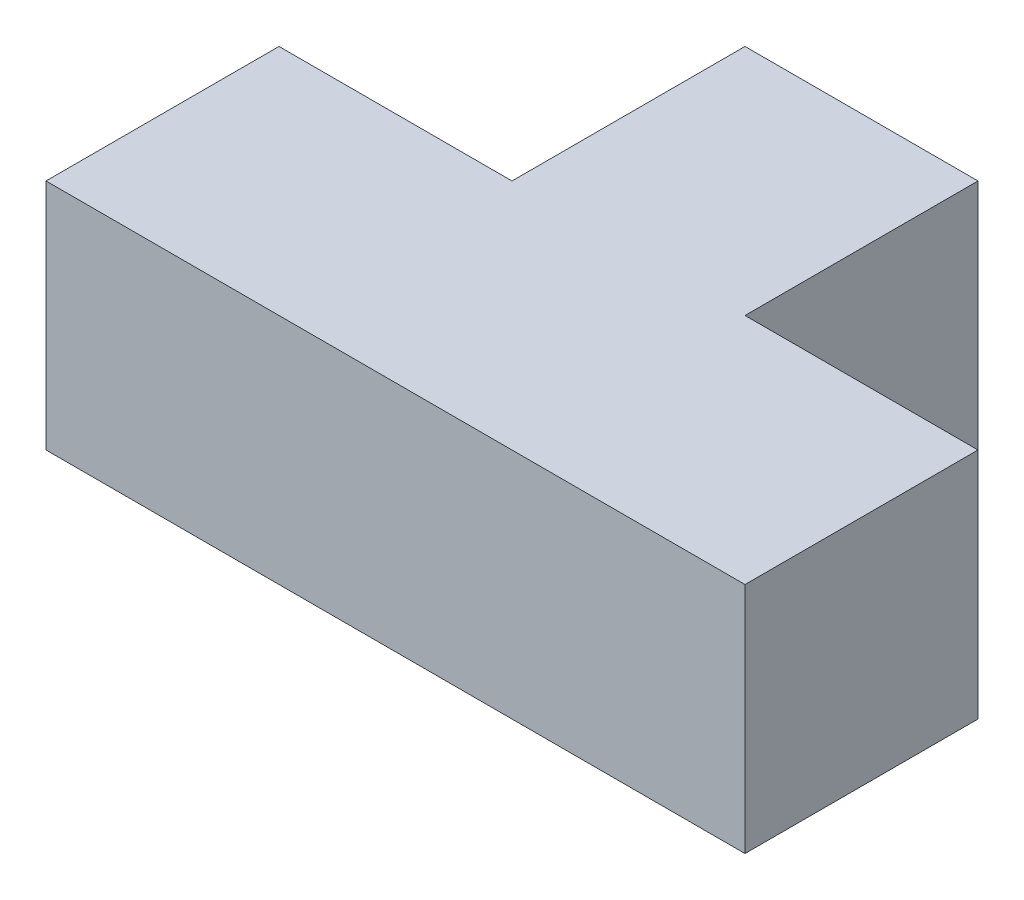
ISO-10303-21;
HEADER;
FILE_DESCRIPTION(('STEP AP214'),'2;1');
FILE_NAME('part.step','',(''),(''),'','','');
FILE_SCHEMA(('AUTOMOTIVE_DESIGN { 1 0 10303 214 1 1 1 1 }'));
ENDSEC;
DATA;
#1=APPLICATION_CONTEXT('core data for automotive mechanical design processes');
#2=APPLICATION_PROTOCOL_DEFINITION('international standard','automotive_design',2000,#1);
#3=PRODUCT_CONTEXT('',#1,'mechanical');
#4=PRODUCT('Part','Part','',(#3));
#5=PRODUCT_RELATED_PRODUCT_CATEGORY('part','',(#4));
#6=PRODUCT_DEFINITION_FORMATION('','',#4);
#7=PRODUCT_DEFINITION_CONTEXT('part definition',#1,'design');
#8=PRODUCT_DEFINITION('design','',#6,#7);
#9=PRODUCT_DEFINITION_SHAPE('','',#8);
#10=(LENGTH_UNIT() NAMED_UNIT(*) SI_UNIT(.MILLI.,.METRE.));
#11=(NAMED_UNIT(*) PLANE_ANGLE_UNIT() SI_UNIT($,.RADIAN.));
#12=(NAMED_UNIT(*) SI_UNIT($,.STERADIAN.) SOLID_ANGLE_UNIT());
#13=UNCERTAINTY_MEASURE_WITH_UNIT(LENGTH_MEASURE(1.E-05),#10,'distance_accuracy_value','');
#14=(GEOMETRIC_REPRESENTATION_CONTEXT(3) GLOBAL_UNCERTAINTY_ASSIGNED_CONTEXT((#13)) GLOBAL_UNIT_ASSIGNED_CONTEXT((#10,
#11,#12)) REPRESENTATION_CONTEXT('',''));
#15=CARTESIAN_POINT('',(0.,0.,0.));
#16=DIRECTION('',(0.,0.,1.));
#17=DIRECTION('',(1.,0.,0.));
#18=AXIS2_PLACEMENT_3D('',#15,#16,#17);
#19=CARTESIAN_POINT('',(-30.,30.,-30.));
#20=DIRECTION('',(1.,0.,0.));
#21=DIRECTION('',(0.,0.,-1.));
#22=AXIS2_PLACEMENT_3D('',#19,#20,#21);
#23=PLANE('',#22);
#24=DIRECTION('',(0.,0.,1.));
#25=VECTOR('',#24,1.);
#26=CARTESIAN_POINT('',(-30.,0.,-30.));
#27=LINE('',#26,#25);
#28=CARTESIAN_POINT('',(-30.,0.,-30.));
#29=VERTEX_POINT('',#28);
#30=CARTESIAN_POINT('',(-30.,0.,0.));
#31=VERTEX_POINT('',#30);
#32=EDGE_CURVE('E139',#29,#31,#27,.T.);
#33=ORIENTED_EDGE('',*,*,#32,.T.);
#34=DIRECTION('',(0.,-1.,0.));
#35=VECTOR('',#34,1.);
#36=CARTESIAN_POINT('',(-30.,30.,0.));
#37=LINE('',#36,#35);
#38=CARTESIAN_POINT('',(-30.,30.,0.));
#39=VERTEX_POINT('',#38);
#40=EDGE_CURVE('E11',#39,#31,#37,.T.);
#41=ORIENTED_EDGE('',*,*,#40,.F.);
#42=DIRECTION('',(0.,0.,1.));
#43=VECTOR('',#42,1.);
#44=CARTESIAN_POINT('',(-30.,30.,-30.));
#45=LINE('',#44,#43);
#46=CARTESIAN_POINT('',(-30.,30.,-30.));
#47=VERTEX_POINT('',#46);
#48=EDGE_CURVE('E153',#47,#39,#45,.T.);
#49=ORIENTED_EDGE('',*,*,#48,.F.);
#50=DIRECTION('',(0.,-1.,0.));
#51=VECTOR('',#50,1.);
#52=CARTESIAN_POINT('',(-30.,30.,-30.));
#53=LINE('',#52,#51);
#54=EDGE_CURVE('E135',#47,#29,#53,.T.);
#55=ORIENTED_EDGE('',*,*,#54,.T.);
#56=EDGE_LOOP('',(#33,#41,#49,#55));
#57=FACE_BOUND('',#56,.T.);
#58=ADVANCED_FACE('F43',(#57),#23,.F.);
#59=CARTESIAN_POINT('',(-30.,30.,0.));
#60=DIRECTION('',(0.,0.,-1.));
#61=DIRECTION('',(-1.,0.,0.));
#62=AXIS2_PLACEMENT_3D('',#59,#60,#61);
#63=PLANE('',#62);
#64=DIRECTION('',(1.,0.,0.));
#65=VECTOR('',#64,1.);
#66=CARTESIAN_POINT('',(-30.,0.,0.));
#67=LINE('',#66,#65);
#68=CARTESIAN_POINT('',(60.,0.,0.));
#69=VERTEX_POINT('',#68);
#70=EDGE_CURVE('E142',#31,#69,#67,.T.);
#71=ORIENTED_EDGE('',*,*,#70,.T.);
#72=DIRECTION('',(0.,-1.,0.));
#73=VECTOR('',#72,1.);
#74=CARTESIAN_POINT('',(60.,30.,0.));
#75=LINE('',#74,#73);
#76=CARTESIAN_POINT('',(60.,30.,0.));
#77=VERTEX_POINT('',#76);
#78=EDGE_CURVE('E51',#77,#69,#75,.T.);
#79=ORIENTED_EDGE('',*,*,#78,.F.);
#80=DIRECTION('',(1.,0.,0.));
#81=VECTOR('',#80,1.);
#82=CARTESIAN_POINT('',(-30.,30.,0.));
#83=LINE('',#82,#81);
#84=EDGE_CURVE('E102',#39,#77,#83,.T.);
#85=ORIENTED_EDGE('',*,*,#84,.F.);
#86=ORIENTED_EDGE('',*,*,#40,.T.);
#87=EDGE_LOOP('',(#71,#79,#85,#86));
#88=FACE_BOUND('',#87,.T.);
#89=ADVANCED_FACE('F188',(#88),#63,.F.);
#90=CARTESIAN_POINT('',(60.,30.,-30.));
#91=DIRECTION('',(-1.,0.,0.));
#92=DIRECTION('',(0.,0.,1.));
#93=AXIS2_PLACEMENT_3D('',#90,#91,#92);
#94=PLANE('',#93);
#95=DIRECTION('',(0.,0.,-1.));
#96=VECTOR('',#95,1.);
#97=CARTESIAN_POINT('',(60.,0.,-30.));
#98=LINE('',#97,#96);
#99=CARTESIAN_POINT('',(60.,0.,-30.));
#100=VERTEX_POINT('',#99);
#101=EDGE_CURVE('E144',#69,#100,#98,.T.);
#102=ORIENTED_EDGE('',*,*,#101,.T.);
#103=DIRECTION('',(0.,-1.,0.));
#104=VECTOR('',#103,1.);
#105=CARTESIAN_POINT('',(60.,30.,-30.));
#106=LINE('',#105,#104);
#107=CARTESIAN_POINT('',(60.,30.,-30.));
#108=VERTEX_POINT('',#107);
#109=EDGE_CURVE('E160',#108,#100,#106,.T.);
#110=ORIENTED_EDGE('',*,*,#109,.F.);
#111=DIRECTION('',(0.,0.,-1.));
#112=VECTOR('',#111,1.);
#113=CARTESIAN_POINT('',(60.,30.,-30.));
#114=LINE('',#113,#112);
#115=EDGE_CURVE('E168',#77,#108,#114,.T.);
#116=ORIENTED_EDGE('',*,*,#115,.F.);
#117=ORIENTED_EDGE('',*,*,#78,.T.);
#118=EDGE_LOOP('',(#102,#110,#116,#117));
#119=FACE_BOUND('',#118,.T.);
#120=ADVANCED_FACE('F166',(#119),#94,.F.);
#121=CARTESIAN_POINT('',(30.,30.,-30.));
#122=DIRECTION('',(0.,0.,1.));
#123=DIRECTION('',(1.,0.,0.));
#124=AXIS2_PLACEMENT_3D('',#121,#122,#123);
#125=PLANE('',#124);
#126=DIRECTION('',(-1.,0.,0.));
#127=VECTOR('',#126,1.);
#128=CARTESIAN_POINT('',(30.,0.,-30.));
#129=LINE('',#128,#127);
#130=CARTESIAN_POINT('',(30.,0.,-30.));
#131=VERTEX_POINT('',#130);
#132=EDGE_CURVE('E146',#100,#131,#129,.T.);
#133=ORIENTED_EDGE('',*,*,#132,.T.);
#134=DIRECTION('',(0.,-1.,0.));
#135=VECTOR('',#134,1.);
#136=CARTESIAN_POINT('',(30.,30.,-30.));
#137=LINE('',#136,#135);
#138=CARTESIAN_POINT('',(30.,30.,-30.));
#139=VERTEX_POINT('',#138);
#140=EDGE_CURVE('E157',#139,#131,#137,.T.);
#141=ORIENTED_EDGE('',*,*,#140,.F.);
#142=DIRECTION('',(-1.,0.,0.));
#143=VECTOR('',#142,1.);
#144=CARTESIAN_POINT('',(30.,30.,-30.));
#145=LINE('',#144,#143);
#146=EDGE_CURVE('E180',#108,#139,#145,.T.);
#147=ORIENTED_EDGE('',*,*,#146,.F.);
#148=ORIENTED_EDGE('',*,*,#109,.T.);
#149=EDGE_LOOP('',(#133,#141,#147,#148));
#150=FACE_BOUND('',#149,.T.);
#151=ADVANCED_FACE('F176',(#150),#125,.F.);
#152=CARTESIAN_POINT('',(30.,30.,-60.));
#153=DIRECTION('',(-1.,0.,0.));
#154=DIRECTION('',(0.,0.,1.));
#155=AXIS2_PLACEMENT_3D('',#152,#153,#154);
#156=PLANE('',#155);
#157=DIRECTION('',(0.,0.,-1.));
#158=VECTOR('',#157,1.);
#159=CARTESIAN_POINT('',(30.,0.,-60.));
#160=LINE('',#159,#158);
#161=CARTESIAN_POINT('',(30.,0.,-60.));
#162=VERTEX_POINT('',#161);
#163=EDGE_CURVE('E148',#131,#162,#160,.T.);
#164=ORIENTED_EDGE('',*,*,#163,.T.);
#165=DIRECTION('',(0.,-1.,0.));
#166=VECTOR('',#165,1.);
#167=CARTESIAN_POINT('',(30.,30.,-60.));
#168=LINE('',#167,#166);
#169=CARTESIAN_POINT('',(30.,30.,-60.));
#170=VERTEX_POINT('',#169);
#171=EDGE_CURVE('E130',#170,#162,#168,.T.);
#172=ORIENTED_EDGE('',*,*,#171,.F.);
#173=DIRECTION('',(0.,0.,-1.));
#174=VECTOR('',#173,1.);
#175=CARTESIAN_POINT('',(30.,30.,-60.));
#176=LINE('',#175,#174);
#177=EDGE_CURVE('E121',#139,#170,#176,.T.);
#178=ORIENTED_EDGE('',*,*,#177,.F.);
#179=ORIENTED_EDGE('',*,*,#140,.T.);
#180=EDGE_LOOP('',(#164,#172,#178,#179));
#181=FACE_BOUND('',#180,.T.);
#182=ADVANCED_FACE('F179',(#181),#156,.F.);
#183=CARTESIAN_POINT('',(0.,30.,-60.));
#184=DIRECTION('',(0.,0.,1.));
#185=DIRECTION('',(1.,0.,0.));
#186=AXIS2_PLACEMENT_3D('',#183,#184,#185);
#187=PLANE('',#186);
#188=DIRECTION('',(-1.,0.,0.));
#189=VECTOR('',#188,1.);
#190=CARTESIAN_POINT('',(0.,0.,-60.));
#191=LINE('',#190,#189);
#192=CARTESIAN_POINT('',(0.,0.,-60.));
#193=VERTEX_POINT('',#192);
#194=EDGE_CURVE('E129',#162,#193,#191,.T.);
#195=ORIENTED_EDGE('',*,*,#194,.T.);
#196=DIRECTION('',(0.,-1.,0.));
#197=VECTOR('',#196,1.);
#198=CARTESIAN_POINT('',(0.,30.,-60.));
#199=LINE('',#198,#197);
#200=CARTESIAN_POINT('',(0.,30.,-60.));
#201=VERTEX_POINT('',#200);
#202=EDGE_CURVE('E126',#201,#193,#199,.T.);
#203=ORIENTED_EDGE('',*,*,#202,.F.);
#204=DIRECTION('',(-1.,0.,0.));
#205=VECTOR('',#204,1.);
#206=CARTESIAN_POINT('',(0.,30.,-60.));
#207=LINE('',#206,#205);
#208=EDGE_CURVE('E115',#170,#201,#207,.T.);
#209=ORIENTED_EDGE('',*,*,#208,.F.);
#210=ORIENTED_EDGE('',*,*,#171,.T.);
#211=EDGE_LOOP('',(#195,#203,#209,#210));
#212=FACE_BOUND('',#211,.T.);
#213=ADVANCED_FACE('F127',(#212),#187,.F.);
#214=CARTESIAN_POINT('',(0.,30.,-30.));
#215=DIRECTION('',(1.,0.,0.));
#216=DIRECTION('',(0.,0.,-1.));
#217=AXIS2_PLACEMENT_3D('',#214,#215,#216);
#218=PLANE('',#217);
#219=DIRECTION('',(0.,0.,1.));
#220=VECTOR('',#219,1.);
#221=CARTESIAN_POINT('',(0.,0.,-30.));
#222=LINE('',#221,#220);
#223=CARTESIAN_POINT('',(0.,0.,-30.));
#224=VERTEX_POINT('',#223);
#225=EDGE_CURVE('E88',#193,#224,#222,.T.);
#226=ORIENTED_EDGE('',*,*,#225,.T.);
#227=DIRECTION('',(0.,-1.,0.));
#228=VECTOR('',#227,1.);
#229=CARTESIAN_POINT('',(0.,30.,-30.));
#230=LINE('',#229,#228);
#231=CARTESIAN_POINT('',(0.,30.,-30.));
#232=VERTEX_POINT('',#231);
#233=EDGE_CURVE('E131',#232,#224,#230,.T.);
#234=ORIENTED_EDGE('',*,*,#233,.F.);
#235=DIRECTION('',(0.,0.,1.));
#236=VECTOR('',#235,1.);
#237=CARTESIAN_POINT('',(0.,30.,-30.));
#238=LINE('',#237,#236);
#239=EDGE_CURVE('E119',#201,#232,#238,.T.);
#240=ORIENTED_EDGE('',*,*,#239,.F.);
#241=ORIENTED_EDGE('',*,*,#202,.T.);
#242=EDGE_LOOP('',(#226,#234,#240,#241));
#243=FACE_BOUND('',#242,.T.);
#244=ADVANCED_FACE('F133',(#243),#218,.F.);
#245=CARTESIAN_POINT('',(-30.,30.,-30.));
#246=DIRECTION('',(0.,0.,1.));
#247=DIRECTION('',(1.,0.,0.));
#248=AXIS2_PLACEMENT_3D('',#245,#246,#247);
#249=PLANE('',#248);
#250=DIRECTION('',(-1.,0.,0.));
#251=VECTOR('',#250,1.);
#252=CARTESIAN_POINT('',(-30.,0.,-30.));
#253=LINE('',#252,#251);
#254=EDGE_CURVE('E94',#224,#29,#253,.T.);
#255=ORIENTED_EDGE('',*,*,#254,.T.);
#256=ORIENTED_EDGE('',*,*,#54,.F.);
#257=DIRECTION('',(-1.,0.,0.));
#258=VECTOR('',#257,1.);
#259=CARTESIAN_POINT('',(-30.,30.,-30.));
#260=LINE('',#259,#258);
#261=EDGE_CURVE('E59',#232,#47,#260,.T.);
#262=ORIENTED_EDGE('',*,*,#261,.F.);
#263=ORIENTED_EDGE('',*,*,#233,.T.);
#264=EDGE_LOOP('',(#255,#256,#262,#263));
#265=FACE_BOUND('',#264,.T.);
#266=ADVANCED_FACE('F204',(#265),#249,.F.);
#267=CARTESIAN_POINT('',(0.,30.,0.));
#268=DIRECTION('',(0.,1.,0.));
#269=DIRECTION('',(0.,0.,1.));
#270=AXIS2_PLACEMENT_3D('',#267,#268,#269);
#271=PLANE('',#270);
#272=ORIENTED_EDGE('',*,*,#48,.T.);
#273=ORIENTED_EDGE('',*,*,#84,.T.);
#274=ORIENTED_EDGE('',*,*,#115,.T.);
#275=ORIENTED_EDGE('',*,*,#146,.T.);
#276=ORIENTED_EDGE('',*,*,#177,.T.);
#277=ORIENTED_EDGE('',*,*,#208,.T.);
#278=ORIENTED_EDGE('',*,*,#239,.T.);
#279=ORIENTED_EDGE('',*,*,#261,.T.);
#280=EDGE_LOOP('',(#272,#273,#274,#275,#276,#277,#278,#279));
#281=FACE_BOUND('',#280,.T.);
#282=ADVANCED_FACE('F117',(#281),#271,.T.);
#283=CARTESIAN_POINT('',(0.,0.,0.));
#284=DIRECTION('',(0.,1.,0.));
#285=DIRECTION('',(0.,0.,1.));
#286=AXIS2_PLACEMENT_3D('',#283,#284,#285);
#287=PLANE('',#286);
#288=ORIENTED_EDGE('',*,*,#32,.F.);
#289=ORIENTED_EDGE('',*,*,#254,.F.);
#290=ORIENTED_EDGE('',*,*,#225,.F.);
#291=ORIENTED_EDGE('',*,*,#194,.F.);
#292=ORIENTED_EDGE('',*,*,#163,.F.);
#293=ORIENTED_EDGE('',*,*,#132,.F.);
#294=ORIENTED_EDGE('',*,*,#101,.F.);
#295=ORIENTED_EDGE('',*,*,#70,.F.);
#296=EDGE_LOOP('',(#288,#289,#290,#291,#292,#293,#294,#295));
#297=FACE_BOUND('',#296,.T.);
#298=ADVANCED_FACE('F172',(#297),#287,.F.);
#299=CLOSED_SHELL('',(#58,#89,#120,#151,#182,#213,#244,#266,#282,#298));
#300=MANIFOLD_SOLID_BREP('B2',#299);
#301=ADVANCED_BREP_SHAPE_REPRESENTATION('',(#18,#300),#14);
#302=SHAPE_DEFINITION_REPRESENTATION(#9,#301);
ENDSEC;
END-ISO-10303-21;
